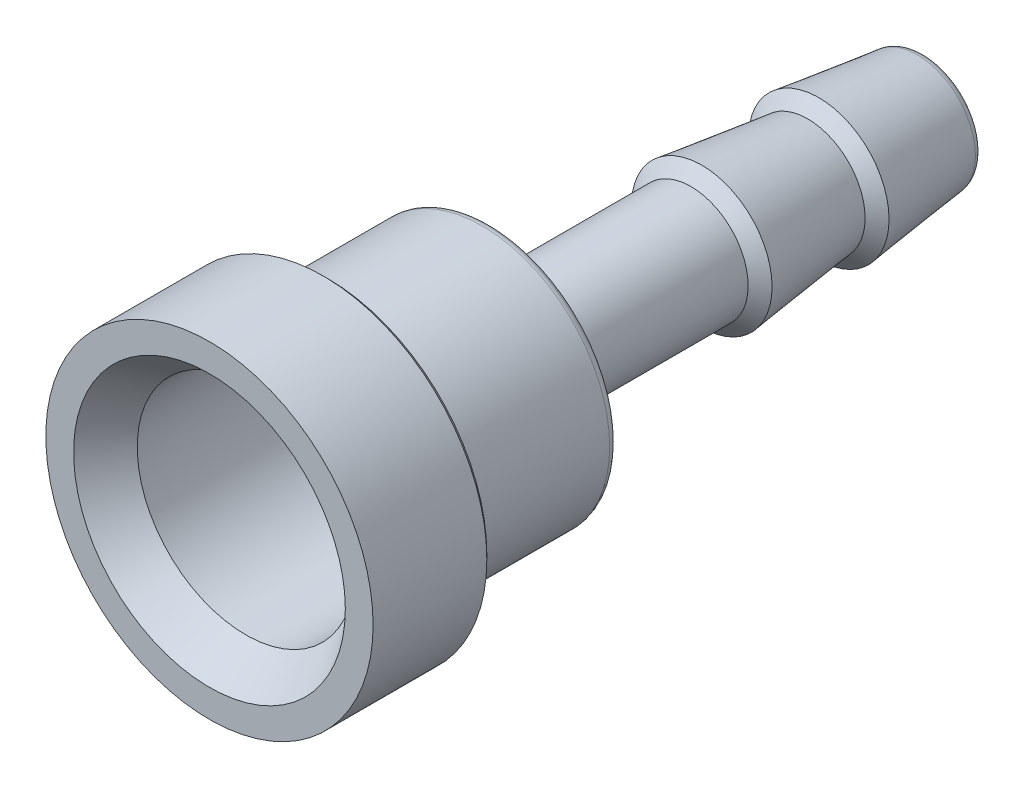
ISO-10303-21;
HEADER;
FILE_DESCRIPTION(('STEP AP214'),'2;1');
FILE_NAME('part.step','',(''),(''),'','','');
FILE_SCHEMA(('AUTOMOTIVE_DESIGN { 1 0 10303 214 1 1 1 1 }'));
ENDSEC;
DATA;
#1=APPLICATION_CONTEXT('core data for automotive mechanical design processes');
#2=APPLICATION_PROTOCOL_DEFINITION('international standard','automotive_design',2000,#1);
#3=PRODUCT_CONTEXT('',#1,'mechanical');
#4=PRODUCT('Part','Part','',(#3));
#5=PRODUCT_RELATED_PRODUCT_CATEGORY('part','',(#4));
#6=PRODUCT_DEFINITION_FORMATION('','',#4);
#7=PRODUCT_DEFINITION_CONTEXT('part definition',#1,'design');
#8=PRODUCT_DEFINITION('design','',#6,#7);
#9=PRODUCT_DEFINITION_SHAPE('','',#8);
#10=(LENGTH_UNIT() NAMED_UNIT(*) SI_UNIT(.MILLI.,.METRE.));
#11=(NAMED_UNIT(*) PLANE_ANGLE_UNIT() SI_UNIT($,.RADIAN.));
#12=(NAMED_UNIT(*) SI_UNIT($,.STERADIAN.) SOLID_ANGLE_UNIT());
#13=UNCERTAINTY_MEASURE_WITH_UNIT(LENGTH_MEASURE(1.E-05),#10,'distance_accuracy_value','');
#14=(GEOMETRIC_REPRESENTATION_CONTEXT(3) GLOBAL_UNCERTAINTY_ASSIGNED_CONTEXT((#13)) GLOBAL_UNIT_ASSIGNED_CONTEXT((#10,
#11,#12)) REPRESENTATION_CONTEXT('',''));
#15=CARTESIAN_POINT('',(0.,0.,0.));
#16=DIRECTION('',(0.,0.,1.));
#17=DIRECTION('',(1.,0.,0.));
#18=AXIS2_PLACEMENT_3D('',#15,#16,#17);
#19=CARTESIAN_POINT('',(0.,1.11125,-20.9296));
#20=DIRECTION('',(0.,0.,1.));
#21=DIRECTION('',(1.,0.,0.));
#22=AXIS2_PLACEMENT_3D('',#19,#20,#21);
#23=PLANE('',#22);
#24=CARTESIAN_POINT('',(0.,0.,-20.9296));
#25=DIRECTION('',(0.,0.,1.));
#26=DIRECTION('',(1.,0.,0.));
#27=AXIS2_PLACEMENT_3D('',#24,#25,#26);
#28=CIRCLE('',#27,1.45167978280279);
#29=CARTESIAN_POINT('',(1.45167978280279,0.,-20.9296));
#30=VERTEX_POINT('',#29);
#31=EDGE_CURVE('E11',#30,#30,#28,.F.);
#32=ORIENTED_EDGE('',*,*,#31,.T.);
#33=EDGE_LOOP('',(#32));
#34=FACE_BOUND('',#33,.T.);
#35=CARTESIAN_POINT('',(0.,0.,-20.9296));
#36=DIRECTION('',(0.,0.,1.));
#37=DIRECTION('',(1.,0.,0.));
#38=AXIS2_PLACEMENT_3D('',#35,#36,#37);
#39=CIRCLE('',#38,1.11125);
#40=CARTESIAN_POINT('',(1.11125,0.,-20.9296));
#41=VERTEX_POINT('',#40);
#42=EDGE_CURVE('E106',#41,#41,#39,.T.);
#43=ORIENTED_EDGE('',*,*,#42,.T.);
#44=EDGE_LOOP('',(#43));
#45=FACE_BOUND('',#44,.T.);
#46=ADVANCED_FACE('F47',(#34,#45),#23,.F.);
#47=CARTESIAN_POINT('',(0.,0.,-20.9296));
#48=DIRECTION('',(0.,0.,1.));
#49=DIRECTION('',(1.,0.,0.));
#50=AXIS2_PLACEMENT_3D('',#47,#48,#49);
#51=CONICAL_SURFACE('',#50,1.6764,0.122173047639596);
#52=CARTESIAN_POINT('',(0.,0.,-20.7065548132249));
#53=DIRECTION('',(0.,0.,-1.));
#54=DIRECTION('',(-1.,0.,0.));
#55=AXIS2_PLACEMENT_3D('',#52,#53,#54);
#56=CIRCLE('',#55,1.70378650531969);
#57=CARTESIAN_POINT('',(-1.70378650531969,0.,-20.7065548132249));
#58=VERTEX_POINT('',#57);
#59=EDGE_CURVE('E54',#58,#58,#56,.F.);
#60=ORIENTED_EDGE('',*,*,#59,.T.);
#61=EDGE_LOOP('',(#60));
#62=FACE_BOUND('',#61,.T.);
#63=CARTESIAN_POINT('',(0.,0.,-17.8266040109415));
#64=DIRECTION('',(0.,0.,1.));
#65=DIRECTION('',(1.,0.,0.));
#66=AXIS2_PLACEMENT_3D('',#63,#64,#65);
#67=CIRCLE('',#66,2.0574);
#68=CARTESIAN_POINT('',(2.0574,0.,-17.8266040109415));
#69=VERTEX_POINT('',#68);
#70=EDGE_CURVE('E67',#69,#69,#67,.T.);
#71=ORIENTED_EDGE('',*,*,#70,.F.);
#72=EDGE_LOOP('',(#71));
#73=FACE_BOUND('',#72,.T.);
#74=ADVANCED_FACE('F172',(#62,#73),#51,.T.);
#75=CARTESIAN_POINT('',(0.,0.,-17.8266040109415));
#76=DIRECTION('',(0.,0.,-1.));
#77=DIRECTION('',(-1.,0.,0.));
#78=AXIS2_PLACEMENT_3D('',#75,#76,#77);
#79=CONICAL_SURFACE('',#78,2.0574,0.872664625997159);
#80=CARTESIAN_POINT('',(0.,0.,-17.506907051463));
#81=DIRECTION('',(0.,0.,1.));
#82=DIRECTION('',(1.,0.,0.));
#83=AXIS2_PLACEMENT_3D('',#80,#81,#82);
#84=CIRCLE('',#83,1.6764);
#85=CARTESIAN_POINT('',(1.6764,0.,-17.506907051463));
#86=VERTEX_POINT('',#85);
#87=EDGE_CURVE('E70',#86,#86,#84,.T.);
#88=ORIENTED_EDGE('',*,*,#87,.F.);
#89=EDGE_LOOP('',(#88));
#90=FACE_BOUND('',#89,.T.);
#91=ORIENTED_EDGE('',*,*,#70,.T.);
#92=EDGE_LOOP('',(#91));
#93=FACE_BOUND('',#92,.T.);
#94=ADVANCED_FACE('F177',(#90,#93),#79,.T.);
#95=CARTESIAN_POINT('',(0.,0.,-17.506907051463));
#96=DIRECTION('',(0.,0.,1.));
#97=DIRECTION('',(1.,0.,0.));
#98=AXIS2_PLACEMENT_3D('',#95,#96,#97);
#99=CONICAL_SURFACE('',#98,1.6764,0.122173047639596);
#100=CARTESIAN_POINT('',(0.,0.,-14.4039110624045));
#101=DIRECTION('',(0.,0.,1.));
#102=DIRECTION('',(1.,0.,0.));
#103=AXIS2_PLACEMENT_3D('',#100,#101,#102);
#104=CIRCLE('',#103,2.0574);
#105=CARTESIAN_POINT('',(2.0574,0.,-14.4039110624045));
#106=VERTEX_POINT('',#105);
#107=EDGE_CURVE('E73',#106,#106,#104,.T.);
#108=ORIENTED_EDGE('',*,*,#107,.F.);
#109=EDGE_LOOP('',(#108));
#110=FACE_BOUND('',#109,.T.);
#111=ORIENTED_EDGE('',*,*,#87,.T.);
#112=EDGE_LOOP('',(#111));
#113=FACE_BOUND('',#112,.T.);
#114=ADVANCED_FACE('F200',(#110,#113),#99,.T.);
#115=CARTESIAN_POINT('',(0.,0.,-14.4039110624045));
#116=DIRECTION('',(0.,0.,-1.));
#117=DIRECTION('',(-1.,0.,0.));
#118=AXIS2_PLACEMENT_3D('',#115,#116,#117);
#119=CONICAL_SURFACE('',#118,2.0574,0.87266462599716);
#120=CARTESIAN_POINT('',(0.,0.,-14.0842141029259));
#121=DIRECTION('',(0.,0.,1.));
#122=DIRECTION('',(1.,0.,0.));
#123=AXIS2_PLACEMENT_3D('',#120,#121,#122);
#124=CIRCLE('',#123,1.6764);
#125=CARTESIAN_POINT('',(1.6764,0.,-14.0842141029259));
#126=VERTEX_POINT('',#125);
#127=EDGE_CURVE('E76',#126,#126,#124,.T.);
#128=ORIENTED_EDGE('',*,*,#127,.F.);
#129=EDGE_LOOP('',(#128));
#130=FACE_BOUND('',#129,.T.);
#131=ORIENTED_EDGE('',*,*,#107,.T.);
#132=EDGE_LOOP('',(#131));
#133=FACE_BOUND('',#132,.T.);
#134=ADVANCED_FACE('F194',(#130,#133),#119,.T.);
#135=CARTESIAN_POINT('',(0.,0.,-9.41269891851943));
#136=DIRECTION('',(0.,0.,1.));
#137=DIRECTION('',(1.,0.,0.));
#138=AXIS2_PLACEMENT_3D('',#135,#136,#137);
#139=CYLINDRICAL_SURFACE('',#138,1.6764);
#140=CARTESIAN_POINT('',(0.,0.,-8.2296));
#141=DIRECTION('',(0.,0.,1.));
#142=DIRECTION('',(1.,0.,0.));
#143=AXIS2_PLACEMENT_3D('',#140,#141,#142);
#144=CIRCLE('',#143,1.6764);
#145=CARTESIAN_POINT('',(1.6764,0.,-8.2296));
#146=VERTEX_POINT('',#145);
#147=EDGE_CURVE('E79',#146,#146,#144,.T.);
#148=ORIENTED_EDGE('',*,*,#147,.F.);
#149=EDGE_LOOP('',(#148));
#150=FACE_BOUND('',#149,.T.);
#151=ORIENTED_EDGE('',*,*,#127,.T.);
#152=EDGE_LOOP('',(#151));
#153=FACE_BOUND('',#152,.T.);
#154=ADVANCED_FACE('F168',(#150,#153),#139,.T.);
#155=CARTESIAN_POINT('',(0.,1.6764,-8.2296));
#156=DIRECTION('',(0.,0.,1.));
#157=DIRECTION('',(1.,0.,0.));
#158=AXIS2_PLACEMENT_3D('',#155,#156,#157);
#159=PLANE('',#158);
#160=CARTESIAN_POINT('',(0.,0.,-8.2296));
#161=DIRECTION('',(0.,0.,1.));
#162=DIRECTION('',(1.,0.,0.));
#163=AXIS2_PLACEMENT_3D('',#160,#161,#162);
#164=CIRCLE('',#163,3.4798);
#165=CARTESIAN_POINT('',(3.4798,0.,-8.2296));
#166=VERTEX_POINT('',#165);
#167=EDGE_CURVE('E58',#166,#166,#164,.F.);
#168=ORIENTED_EDGE('',*,*,#167,.T.);
#169=EDGE_LOOP('',(#168));
#170=FACE_BOUND('',#169,.T.);
#171=ORIENTED_EDGE('',*,*,#147,.T.);
#172=EDGE_LOOP('',(#171));
#173=FACE_BOUND('',#172,.T.);
#174=ADVANCED_FACE('F162',(#170,#173),#159,.F.);
#175=CARTESIAN_POINT('',(0.,0.,-9.41269891851943));
#176=DIRECTION('',(0.,0.,1.));
#177=DIRECTION('',(1.,0.,0.));
#178=AXIS2_PLACEMENT_3D('',#175,#176,#177);
#179=CYLINDRICAL_SURFACE('',#178,3.7338);
#180=CARTESIAN_POINT('',(0.,0.,-7.9756));
#181=DIRECTION('',(0.,0.,1.));
#182=DIRECTION('',(1.,0.,0.));
#183=AXIS2_PLACEMENT_3D('',#180,#181,#182);
#184=CIRCLE('',#183,3.7338);
#185=CARTESIAN_POINT('',(3.7338,0.,-7.9756));
#186=VERTEX_POINT('',#185);
#187=EDGE_CURVE('E62',#186,#186,#184,.T.);
#188=ORIENTED_EDGE('',*,*,#187,.T.);
#189=EDGE_LOOP('',(#188));
#190=FACE_BOUND('',#189,.T.);
#191=CARTESIAN_POINT('',(0.,0.,-3.4544));
#192=DIRECTION('',(0.,0.,1.));
#193=DIRECTION('',(1.,0.,0.));
#194=AXIS2_PLACEMENT_3D('',#191,#192,#193);
#195=CIRCLE('',#194,3.7338);
#196=CARTESIAN_POINT('',(3.7338,0.,-3.4544));
#197=VERTEX_POINT('',#196);
#198=EDGE_CURVE('E82',#197,#197,#195,.T.);
#199=ORIENTED_EDGE('',*,*,#198,.F.);
#200=EDGE_LOOP('',(#199));
#201=FACE_BOUND('',#200,.T.);
#202=ADVANCED_FACE('F157',(#190,#201),#179,.T.);
#203=CARTESIAN_POINT('',(0.,3.7338,-3.4544));
#204=DIRECTION('',(0.,0.,1.));
#205=DIRECTION('',(1.,0.,0.));
#206=AXIS2_PLACEMENT_3D('',#203,#204,#205);
#207=PLANE('',#206);
#208=CARTESIAN_POINT('',(0.,0.,-3.4544));
#209=DIRECTION('',(0.,0.,1.));
#210=DIRECTION('',(1.,0.,0.));
#211=AXIS2_PLACEMENT_3D('',#208,#209,#210);
#212=CIRCLE('',#211,4.6609);
#213=CARTESIAN_POINT('',(4.6609,0.,-3.4544));
#214=VERTEX_POINT('',#213);
#215=EDGE_CURVE('E85',#214,#214,#212,.T.);
#216=ORIENTED_EDGE('',*,*,#215,.F.);
#217=EDGE_LOOP('',(#216));
#218=FACE_BOUND('',#217,.T.);
#219=ORIENTED_EDGE('',*,*,#198,.T.);
#220=EDGE_LOOP('',(#219));
#221=FACE_BOUND('',#220,.T.);
#222=ADVANCED_FACE('F151',(#218,#221),#207,.F.);
#223=CARTESIAN_POINT('',(0.,0.,-3.4544));
#224=DIRECTION('',(0.,0.,1.));
#225=DIRECTION('',(1.,0.,0.));
#226=AXIS2_PLACEMENT_3D('',#223,#224,#225);
#227=CONICAL_SURFACE('',#226,4.6609,0.785398163397448);
#228=CARTESIAN_POINT('',(0.,0.,-3.3274));
#229=DIRECTION('',(0.,0.,1.));
#230=DIRECTION('',(1.,0.,0.));
#231=AXIS2_PLACEMENT_3D('',#228,#229,#230);
#232=CIRCLE('',#231,4.7879);
#233=CARTESIAN_POINT('',(4.7879,0.,-3.3274));
#234=VERTEX_POINT('',#233);
#235=EDGE_CURVE('E88',#234,#234,#232,.T.);
#236=ORIENTED_EDGE('',*,*,#235,.F.);
#237=EDGE_LOOP('',(#236));
#238=FACE_BOUND('',#237,.T.);
#239=ORIENTED_EDGE('',*,*,#215,.T.);
#240=EDGE_LOOP('',(#239));
#241=FACE_BOUND('',#240,.T.);
#242=ADVANCED_FACE('F145',(#238,#241),#227,.T.);
#243=CARTESIAN_POINT('',(0.,0.,-9.41269891851943));
#244=DIRECTION('',(0.,0.,1.));
#245=DIRECTION('',(1.,0.,0.));
#246=AXIS2_PLACEMENT_3D('',#243,#244,#245);
#247=CYLINDRICAL_SURFACE('',#246,4.7879);
#248=CARTESIAN_POINT('',(0.,0.,0.));
#249=DIRECTION('',(0.,0.,1.));
#250=DIRECTION('',(1.,0.,0.));
#251=AXIS2_PLACEMENT_3D('',#248,#249,#250);
#252=CIRCLE('',#251,4.7879);
#253=CARTESIAN_POINT('',(4.7879,0.,0.));
#254=VERTEX_POINT('',#253);
#255=EDGE_CURVE('E91',#254,#254,#252,.T.);
#256=ORIENTED_EDGE('',*,*,#255,.F.);
#257=EDGE_LOOP('',(#256));
#258=FACE_BOUND('',#257,.T.);
#259=ORIENTED_EDGE('',*,*,#235,.T.);
#260=EDGE_LOOP('',(#259));
#261=FACE_BOUND('',#260,.T.);
#262=ADVANCED_FACE('F139',(#258,#261),#247,.T.);
#263=CARTESIAN_POINT('',(0.,4.7879,0.));
#264=DIRECTION('',(0.,0.,-1.));
#265=DIRECTION('',(-1.,0.,0.));
#266=AXIS2_PLACEMENT_3D('',#263,#264,#265);
#267=PLANE('',#266);
#268=CARTESIAN_POINT('',(0.,0.,0.));
#269=DIRECTION('',(0.,0.,1.));
#270=DIRECTION('',(1.,0.,0.));
#271=AXIS2_PLACEMENT_3D('',#268,#269,#270);
#272=CIRCLE('',#271,3.9751);
#273=CARTESIAN_POINT('',(3.9751,0.,0.));
#274=VERTEX_POINT('',#273);
#275=EDGE_CURVE('E94',#274,#274,#272,.T.);
#276=ORIENTED_EDGE('',*,*,#275,.F.);
#277=EDGE_LOOP('',(#276));
#278=FACE_BOUND('',#277,.T.);
#279=ORIENTED_EDGE('',*,*,#255,.T.);
#280=EDGE_LOOP('',(#279));
#281=FACE_BOUND('',#280,.T.);
#282=ADVANCED_FACE('F133',(#278,#281),#267,.F.);
#283=CARTESIAN_POINT('',(0.,0.,0.));
#284=DIRECTION('',(0.,0.,1.));
#285=DIRECTION('',(1.,0.,0.));
#286=AXIS2_PLACEMENT_3D('',#283,#284,#285);
#287=CONICAL_SURFACE('',#286,3.9751,0.645771823237903);
#288=CARTESIAN_POINT('',(0.,0.,-1.06176856177849));
#289=DIRECTION('',(0.,0.,1.));
#290=DIRECTION('',(1.,0.,0.));
#291=AXIS2_PLACEMENT_3D('',#288,#289,#290);
#292=CIRCLE('',#291,3.175);
#293=CARTESIAN_POINT('',(3.175,0.,-1.06176856177849));
#294=VERTEX_POINT('',#293);
#295=EDGE_CURVE('E97',#294,#294,#292,.T.);
#296=ORIENTED_EDGE('',*,*,#295,.F.);
#297=EDGE_LOOP('',(#296));
#298=FACE_BOUND('',#297,.T.);
#299=ORIENTED_EDGE('',*,*,#275,.T.);
#300=EDGE_LOOP('',(#299));
#301=FACE_BOUND('',#300,.T.);
#302=ADVANCED_FACE('F127',(#298,#301),#287,.F.);
#303=CARTESIAN_POINT('',(0.,0.,-9.41269891851943));
#304=DIRECTION('',(0.,0.,1.));
#305=DIRECTION('',(1.,0.,0.));
#306=AXIS2_PLACEMENT_3D('',#303,#304,#305);
#307=CYLINDRICAL_SURFACE('',#306,3.175);
#308=CARTESIAN_POINT('',(0.,0.,-6.35));
#309=DIRECTION('',(0.,0.,1.));
#310=DIRECTION('',(1.,0.,0.));
#311=AXIS2_PLACEMENT_3D('',#308,#309,#310);
#312=CIRCLE('',#311,3.175);
#313=CARTESIAN_POINT('',(3.175,0.,-6.35));
#314=VERTEX_POINT('',#313);
#315=EDGE_CURVE('E100',#314,#314,#312,.T.);
#316=ORIENTED_EDGE('',*,*,#315,.F.);
#317=EDGE_LOOP('',(#316));
#318=FACE_BOUND('',#317,.T.);
#319=ORIENTED_EDGE('',*,*,#295,.T.);
#320=EDGE_LOOP('',(#319));
#321=FACE_BOUND('',#320,.T.);
#322=ADVANCED_FACE('F121',(#318,#321),#307,.F.);
#323=CARTESIAN_POINT('',(0.,0.,-6.35));
#324=DIRECTION('',(0.,0.,1.));
#325=DIRECTION('',(1.,0.,0.));
#326=AXIS2_PLACEMENT_3D('',#323,#324,#325);
#327=CONICAL_SURFACE('',#326,3.175,1.04719755119659);
#328=CARTESIAN_POINT('',(0.,0.,-7.5415066180401));
#329=DIRECTION('',(0.,0.,1.));
#330=DIRECTION('',(1.,0.,0.));
#331=AXIS2_PLACEMENT_3D('',#328,#329,#330);
#332=CIRCLE('',#331,1.11125);
#333=CARTESIAN_POINT('',(1.11125,0.,-7.5415066180401));
#334=VERTEX_POINT('',#333);
#335=EDGE_CURVE('E103',#334,#334,#332,.T.);
#336=ORIENTED_EDGE('',*,*,#335,.F.);
#337=EDGE_LOOP('',(#336));
#338=FACE_BOUND('',#337,.T.);
#339=ORIENTED_EDGE('',*,*,#315,.T.);
#340=EDGE_LOOP('',(#339));
#341=FACE_BOUND('',#340,.T.);
#342=ADVANCED_FACE('F115',(#338,#341),#327,.F.);
#343=CARTESIAN_POINT('',(0.,0.,-9.41269891851943));
#344=DIRECTION('',(0.,0.,1.));
#345=DIRECTION('',(1.,0.,0.));
#346=AXIS2_PLACEMENT_3D('',#343,#344,#345);
#347=CYLINDRICAL_SURFACE('',#346,1.11125);
#348=ORIENTED_EDGE('',*,*,#42,.F.);
#349=EDGE_LOOP('',(#348));
#350=FACE_BOUND('',#349,.T.);
#351=ORIENTED_EDGE('',*,*,#335,.T.);
#352=EDGE_LOOP('',(#351));
#353=FACE_BOUND('',#352,.T.);
#354=ADVANCED_FACE('F111',(#350,#353),#347,.F.);
#355=CARTESIAN_POINT('',(0.,0.,-7.9756));
#356=DIRECTION('',(0.,0.,1.));
#357=DIRECTION('',(1.,0.,0.));
#358=AXIS2_PLACEMENT_3D('',#355,#356,#357);
#359=TOROIDAL_SURFACE('',#358,3.4798,0.254);
#360=ORIENTED_EDGE('',*,*,#167,.F.);
#361=EDGE_LOOP('',(#360));
#362=FACE_BOUND('',#361,.T.);
#363=ORIENTED_EDGE('',*,*,#187,.F.);
#364=EDGE_LOOP('',(#363));
#365=FACE_BOUND('',#364,.T.);
#366=ADVANCED_FACE('F114',(#362,#365),#359,.T.);
#367=CARTESIAN_POINT('',(0.,0.,-20.6756));
#368=DIRECTION('',(0.,0.,1.));
#369=DIRECTION('',(1.,0.,0.));
#370=AXIS2_PLACEMENT_3D('',#367,#368,#369);
#371=TOROIDAL_SURFACE('',#370,1.45167978280279,0.254);
#372=ORIENTED_EDGE('',*,*,#31,.F.);
#373=EDGE_LOOP('',(#372));
#374=FACE_BOUND('',#373,.T.);
#375=ORIENTED_EDGE('',*,*,#59,.F.);
#376=EDGE_LOOP('',(#375));
#377=FACE_BOUND('',#376,.T.);
#378=ADVANCED_FACE('F49',(#374,#377),#371,.T.);
#379=CLOSED_SHELL('',(#46,#74,#94,#114,#134,#154,#174,#202,#222,#242,#262,#282,#302,#322,#342,
#354,#366,#378));
#380=MANIFOLD_SOLID_BREP('B2',#379);
#381=ADVANCED_BREP_SHAPE_REPRESENTATION('',(#18,#380),#14);
#382=SHAPE_DEFINITION_REPRESENTATION(#9,#381);
ENDSEC;
END-ISO-10303-21;
